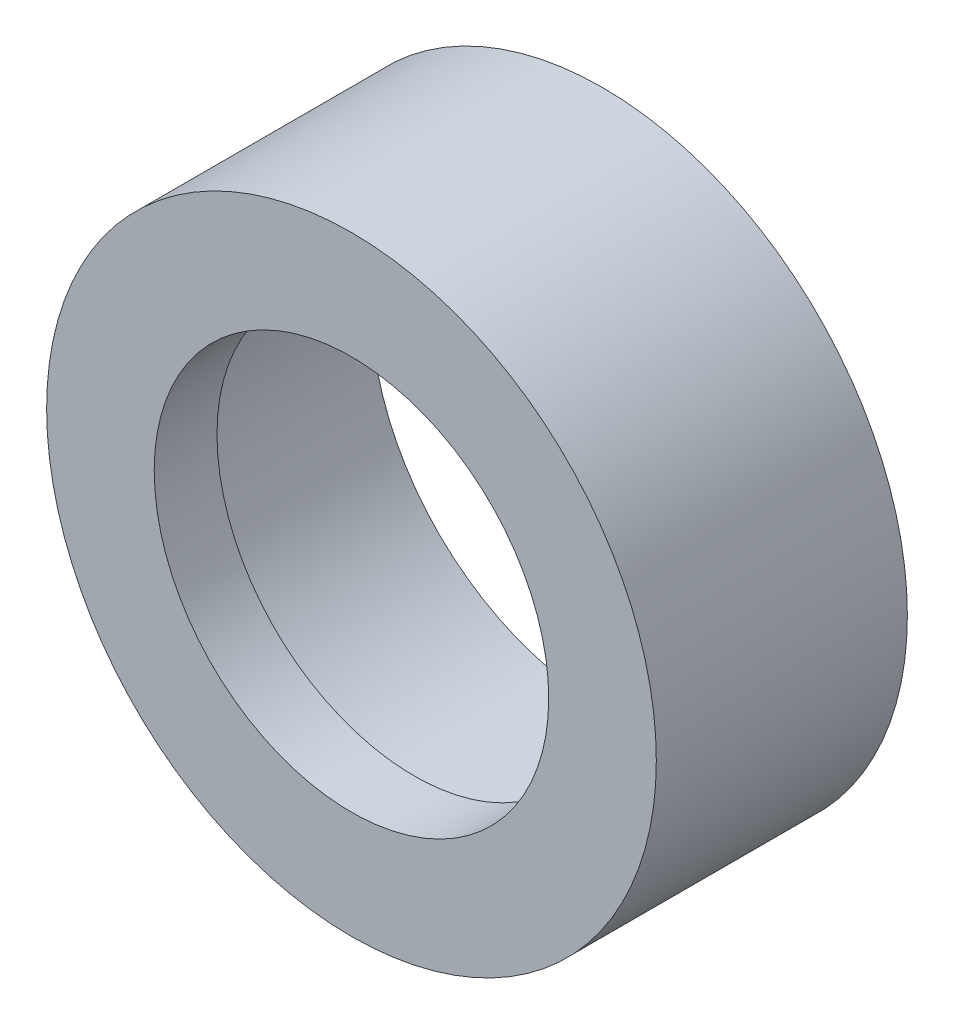
ISO-10303-21;
HEADER;
FILE_DESCRIPTION(('STEP AP214'),'2;1');
FILE_NAME('part.step','',(''),(''),'','','');
FILE_SCHEMA(('AUTOMOTIVE_DESIGN { 1 0 10303 214 1 1 1 1 }'));
ENDSEC;
DATA;
#1=APPLICATION_CONTEXT('core data for automotive mechanical design processes');
#2=APPLICATION_PROTOCOL_DEFINITION('international standard','automotive_design',2000,#1);
#3=PRODUCT_CONTEXT('',#1,'mechanical');
#4=PRODUCT('Part','Part','',(#3));
#5=PRODUCT_RELATED_PRODUCT_CATEGORY('part','',(#4));
#6=PRODUCT_DEFINITION_FORMATION('','',#4);
#7=PRODUCT_DEFINITION_CONTEXT('part definition',#1,'design');
#8=PRODUCT_DEFINITION('design','',#6,#7);
#9=PRODUCT_DEFINITION_SHAPE('','',#8);
#10=(LENGTH_UNIT() NAMED_UNIT(*) SI_UNIT(.MILLI.,.METRE.));
#11=(NAMED_UNIT(*) PLANE_ANGLE_UNIT() SI_UNIT($,.RADIAN.));
#12=(NAMED_UNIT(*) SI_UNIT($,.STERADIAN.) SOLID_ANGLE_UNIT());
#13=UNCERTAINTY_MEASURE_WITH_UNIT(LENGTH_MEASURE(1.E-05),#10,'distance_accuracy_value','');
#14=(GEOMETRIC_REPRESENTATION_CONTEXT(3) GLOBAL_UNCERTAINTY_ASSIGNED_CONTEXT((#13)) GLOBAL_UNIT_ASSIGNED_CONTEXT((#10,
#11,#12)) REPRESENTATION_CONTEXT('',''));
#15=CARTESIAN_POINT('',(0.,0.,0.));
#16=DIRECTION('',(0.,0.,1.));
#17=DIRECTION('',(1.,0.,0.));
#18=AXIS2_PLACEMENT_3D('',#15,#16,#17);
#19=CARTESIAN_POINT('',(0.,0.,14.));
#20=DIRECTION('',(0.,0.,-1.));
#21=DIRECTION('',(-1.,0.,0.));
#22=AXIS2_PLACEMENT_3D('',#19,#20,#21);
#23=CYLINDRICAL_SURFACE('',#22,17.);
#24=CARTESIAN_POINT('',(0.,0.,14.));
#25=DIRECTION('',(0.,0.,1.));
#26=DIRECTION('',(1.,0.,0.));
#27=AXIS2_PLACEMENT_3D('',#24,#25,#26);
#28=CIRCLE('',#27,17.);
#29=CARTESIAN_POINT('',(17.,0.,14.));
#30=VERTEX_POINT('',#29);
#31=EDGE_CURVE('E10',#30,#30,#28,.T.);
#32=ORIENTED_EDGE('',*,*,#31,.F.);
#33=EDGE_LOOP('',(#32));
#34=FACE_BOUND('',#33,.T.);
#35=CARTESIAN_POINT('',(0.,0.,0.));
#36=DIRECTION('',(0.,0.,1.));
#37=DIRECTION('',(1.,0.,0.));
#38=AXIS2_PLACEMENT_3D('',#35,#36,#37);
#39=CIRCLE('',#38,17.);
#40=CARTESIAN_POINT('',(17.,0.,0.));
#41=VERTEX_POINT('',#40);
#42=EDGE_CURVE('E47',#41,#41,#39,.T.);
#43=ORIENTED_EDGE('',*,*,#42,.T.);
#44=EDGE_LOOP('',(#43));
#45=FACE_BOUND('',#44,.T.);
#46=ADVANCED_FACE('F39',(#34,#45),#23,.T.);
#47=CARTESIAN_POINT('',(0.,0.,14.));
#48=DIRECTION('',(0.,0.,1.));
#49=DIRECTION('',(1.,0.,0.));
#50=AXIS2_PLACEMENT_3D('',#47,#48,#49);
#51=PLANE('',#50);
#52=CARTESIAN_POINT('',(0.,0.,14.));
#53=DIRECTION('',(0.,0.,1.));
#54=DIRECTION('',(1.,0.,0.));
#55=AXIS2_PLACEMENT_3D('',#52,#53,#54);
#56=CIRCLE('',#55,11.);
#57=CARTESIAN_POINT('',(11.,0.,14.));
#58=VERTEX_POINT('',#57);
#59=EDGE_CURVE('E62',#58,#58,#56,.T.);
#60=ORIENTED_EDGE('',*,*,#59,.F.);
#61=EDGE_LOOP('',(#60));
#62=FACE_BOUND('',#61,.T.);
#63=ORIENTED_EDGE('',*,*,#31,.T.);
#64=EDGE_LOOP('',(#63));
#65=FACE_BOUND('',#64,.T.);
#66=ADVANCED_FACE('F88',(#62,#65),#51,.T.);
#67=CARTESIAN_POINT('',(0.,0.,0.));
#68=DIRECTION('',(0.,0.,1.));
#69=DIRECTION('',(1.,0.,0.));
#70=AXIS2_PLACEMENT_3D('',#67,#68,#69);
#71=PLANE('',#70);
#72=CARTESIAN_POINT('',(0.,0.,0.));
#73=DIRECTION('',(0.,0.,1.));
#74=DIRECTION('',(1.,0.,0.));
#75=AXIS2_PLACEMENT_3D('',#72,#73,#74);
#76=CIRCLE('',#75,12.9);
#77=CARTESIAN_POINT('',(-12.9,0.,0.));
#78=VERTEX_POINT('',#77);
#79=EDGE_CURVE('E55',#78,#78,#76,.T.);
#80=ORIENTED_EDGE('',*,*,#79,.T.);
#81=EDGE_LOOP('',(#80));
#82=FACE_BOUND('',#81,.T.);
#83=ORIENTED_EDGE('',*,*,#42,.F.);
#84=EDGE_LOOP('',(#83));
#85=FACE_BOUND('',#84,.T.);
#86=ADVANCED_FACE('F82',(#82,#85),#71,.F.);
#87=CARTESIAN_POINT('',(0.,0.,10.5));
#88=DIRECTION('',(0.,0.,-1.));
#89=DIRECTION('',(-1.,0.,0.));
#90=AXIS2_PLACEMENT_3D('',#87,#88,#89);
#91=CYLINDRICAL_SURFACE('',#90,12.9);
#92=CARTESIAN_POINT('',(0.,0.,10.5));
#93=DIRECTION('',(0.,0.,1.));
#94=DIRECTION('',(1.,0.,0.));
#95=AXIS2_PLACEMENT_3D('',#92,#93,#94);
#96=CIRCLE('',#95,12.9);
#97=CARTESIAN_POINT('',(-12.9,0.,10.5));
#98=VERTEX_POINT('',#97);
#99=EDGE_CURVE('E53',#98,#98,#96,.T.);
#100=CARTESIAN_POINT('',(-12.9,0.,10.5));
#101=CARTESIAN_POINT('',(-12.9,0.,10.390625));
#102=CARTESIAN_POINT('',(-12.9,0.,10.28125));
#103=CARTESIAN_POINT('',(-12.9,0.,10.0625));
#104=CARTESIAN_POINT('',(-12.9,0.,9.953125));
#105=CARTESIAN_POINT('',(-12.9,0.,9.734375));
#106=CARTESIAN_POINT('',(-12.9,0.,9.625));
#107=CARTESIAN_POINT('',(-12.9,0.,9.40625));
#108=CARTESIAN_POINT('',(-12.9,0.,9.296875));
#109=CARTESIAN_POINT('',(-12.9,0.,9.078125));
#110=CARTESIAN_POINT('',(-12.9,0.,8.96875));
#111=CARTESIAN_POINT('',(-12.9,0.,8.75));
#112=CARTESIAN_POINT('',(-12.9,0.,8.640625));
#113=CARTESIAN_POINT('',(-12.9,0.,8.421875));
#114=CARTESIAN_POINT('',(-12.9,0.,8.3125));
#115=CARTESIAN_POINT('',(-12.9,0.,8.09375));
#116=CARTESIAN_POINT('',(-12.9,0.,7.984375));
#117=CARTESIAN_POINT('',(-12.9,0.,7.765625));
#118=CARTESIAN_POINT('',(-12.9,0.,7.65625));
#119=CARTESIAN_POINT('',(-12.9,0.,7.4375));
#120=CARTESIAN_POINT('',(-12.9,0.,7.328125));
#121=CARTESIAN_POINT('',(-12.9,0.,7.109375));
#122=CARTESIAN_POINT('',(-12.9,0.,7.));
#123=CARTESIAN_POINT('',(-12.9,0.,6.78125));
#124=CARTESIAN_POINT('',(-12.9,0.,6.671875));
#125=CARTESIAN_POINT('',(-12.9,0.,6.453125));
#126=CARTESIAN_POINT('',(-12.9,0.,6.34375));
#127=CARTESIAN_POINT('',(-12.9,0.,6.125));
#128=CARTESIAN_POINT('',(-12.9,0.,6.015625));
#129=CARTESIAN_POINT('',(-12.9,0.,5.796875));
#130=CARTESIAN_POINT('',(-12.9,0.,5.6875));
#131=CARTESIAN_POINT('',(-12.9,0.,5.46875));
#132=CARTESIAN_POINT('',(-12.9,0.,5.359375));
#133=CARTESIAN_POINT('',(-12.9,0.,5.140625));
#134=CARTESIAN_POINT('',(-12.9,0.,5.03125));
#135=CARTESIAN_POINT('',(-12.9,0.,4.8125));
#136=CARTESIAN_POINT('',(-12.9,0.,4.703125));
#137=CARTESIAN_POINT('',(-12.9,0.,4.484375));
#138=CARTESIAN_POINT('',(-12.9,0.,4.375));
#139=CARTESIAN_POINT('',(-12.9,0.,4.15625));
#140=CARTESIAN_POINT('',(-12.9,0.,4.046875));
#141=CARTESIAN_POINT('',(-12.9,0.,3.828125));
#142=CARTESIAN_POINT('',(-12.9,0.,3.71875));
#143=CARTESIAN_POINT('',(-12.9,0.,3.5));
#144=CARTESIAN_POINT('',(-12.9,0.,3.390625));
#145=CARTESIAN_POINT('',(-12.9,0.,3.171875));
#146=CARTESIAN_POINT('',(-12.9,0.,3.0625));
#147=CARTESIAN_POINT('',(-12.9,0.,2.84375));
#148=CARTESIAN_POINT('',(-12.9,0.,2.734375));
#149=CARTESIAN_POINT('',(-12.9,0.,2.515625));
#150=CARTESIAN_POINT('',(-12.9,0.,2.40625));
#151=CARTESIAN_POINT('',(-12.9,0.,2.1875));
#152=CARTESIAN_POINT('',(-12.9,0.,2.078125));
#153=CARTESIAN_POINT('',(-12.9,0.,1.859375));
#154=CARTESIAN_POINT('',(-12.9,0.,1.75));
#155=CARTESIAN_POINT('',(-12.9,0.,1.53125));
#156=CARTESIAN_POINT('',(-12.9,0.,1.421875));
#157=CARTESIAN_POINT('',(-12.9,0.,1.203125));
#158=CARTESIAN_POINT('',(-12.9,0.,1.09375));
#159=CARTESIAN_POINT('',(-12.9,0.,0.875000000000001));
#160=CARTESIAN_POINT('',(-12.9,0.,0.765625000000001));
#161=CARTESIAN_POINT('',(-12.9,0.,0.546875));
#162=CARTESIAN_POINT('',(-12.9,0.,0.4375));
#163=CARTESIAN_POINT('',(-12.9,0.,0.21875));
#164=CARTESIAN_POINT('',(-12.9,0.,0.109375));
#165=CARTESIAN_POINT('',(-12.9,0.,0.));
#166=B_SPLINE_CURVE_WITH_KNOTS('',3,(#100,#101,#102,#103,#104,#105,#106,#107,#108,#109,#110,
#111,#112,#113,#114,#115,#116,#117,#118,#119,#120,#121,#122,#123,#124,#125,#126,#127,#128,#129,
#130,#131,#132,#133,#134,#135,#136,#137,#138,#139,#140,#141,#142,#143,#144,#145,#146,#147,#148,
#149,#150,#151,#152,#153,#154,#155,#156,#157,#158,#159,#160,#161,#162,#163,#164,#165),
.UNSPECIFIED.,.F.,.F.,(4,2,2,2,2,2,2,2,2,2,2,2,2,2,2,2,2,2,2,2,2,2,2,2,2,2,2,2,2,2,2,2,4),(0.,
0.328124999999999,0.656249999999999,0.984374999999999,1.3125,1.640625,1.96875,2.296875,2.625,
2.953125,3.28125,3.609375,3.9375,4.265625,4.59375,4.921875,5.25,5.578125,5.90625,6.234375,
6.5625,6.890625,7.21875,7.546875,7.875,8.203125,8.53125,8.859375,9.1875,9.515625,9.84375,
10.171875,10.5),.UNSPECIFIED.);
#167=EDGE_CURVE('BSEAM76',#98,#78,#166,.T.);
#168=ORIENTED_EDGE('',*,*,#99,.T.);
#169=ORIENTED_EDGE('',*,*,#79,.F.);
#170=ORIENTED_EDGE('',*,*,#167,.T.);
#171=ORIENTED_EDGE('',*,*,#167,.F.);
#172=EDGE_LOOP('',(#168,#170,#169,#171));
#173=FACE_BOUND('',#172,.T.);
#174=ADVANCED_FACE('F76',(#173),#91,.F.);
#175=CARTESIAN_POINT('',(0.,0.,10.5));
#176=DIRECTION('',(0.,0.,1.));
#177=DIRECTION('',(1.,0.,0.));
#178=AXIS2_PLACEMENT_3D('',#175,#176,#177);
#179=PLANE('',#178);
#180=CARTESIAN_POINT('',(0.,0.,10.5));
#181=DIRECTION('',(0.,0.,1.));
#182=DIRECTION('',(1.,0.,0.));
#183=AXIS2_PLACEMENT_3D('',#180,#181,#182);
#184=CIRCLE('',#183,11.);
#185=CARTESIAN_POINT('',(11.,0.,10.5));
#186=VERTEX_POINT('',#185);
#187=EDGE_CURVE('E42',#186,#186,#184,.F.);
#188=ORIENTED_EDGE('',*,*,#187,.F.);
#189=EDGE_LOOP('',(#188));
#190=FACE_BOUND('',#189,.T.);
#191=ORIENTED_EDGE('',*,*,#99,.F.);
#192=EDGE_LOOP('',(#191));
#193=FACE_BOUND('',#192,.T.);
#194=ADVANCED_FACE('F73',(#190,#193),#179,.F.);
#195=CARTESIAN_POINT('',(0.,0.,14.));
#196=DIRECTION('',(0.,0.,-1.));
#197=DIRECTION('',(-1.,0.,0.));
#198=AXIS2_PLACEMENT_3D('',#195,#196,#197);
#199=CYLINDRICAL_SURFACE('',#198,11.);
#200=ORIENTED_EDGE('',*,*,#59,.T.);
#201=EDGE_LOOP('',(#200));
#202=FACE_BOUND('',#201,.T.);
#203=ORIENTED_EDGE('',*,*,#187,.T.);
#204=EDGE_LOOP('',(#203));
#205=FACE_BOUND('',#204,.T.);
#206=ADVANCED_FACE('F71',(#202,#205),#199,.F.);
#207=CLOSED_SHELL('',(#46,#66,#86,#174,#194,#206));
#208=MANIFOLD_SOLID_BREP('B2',#207);
#209=ADVANCED_BREP_SHAPE_REPRESENTATION('',(#18,#208),#14);
#210=SHAPE_DEFINITION_REPRESENTATION(#9,#209);
ENDSEC;
END-ISO-10303-21;
